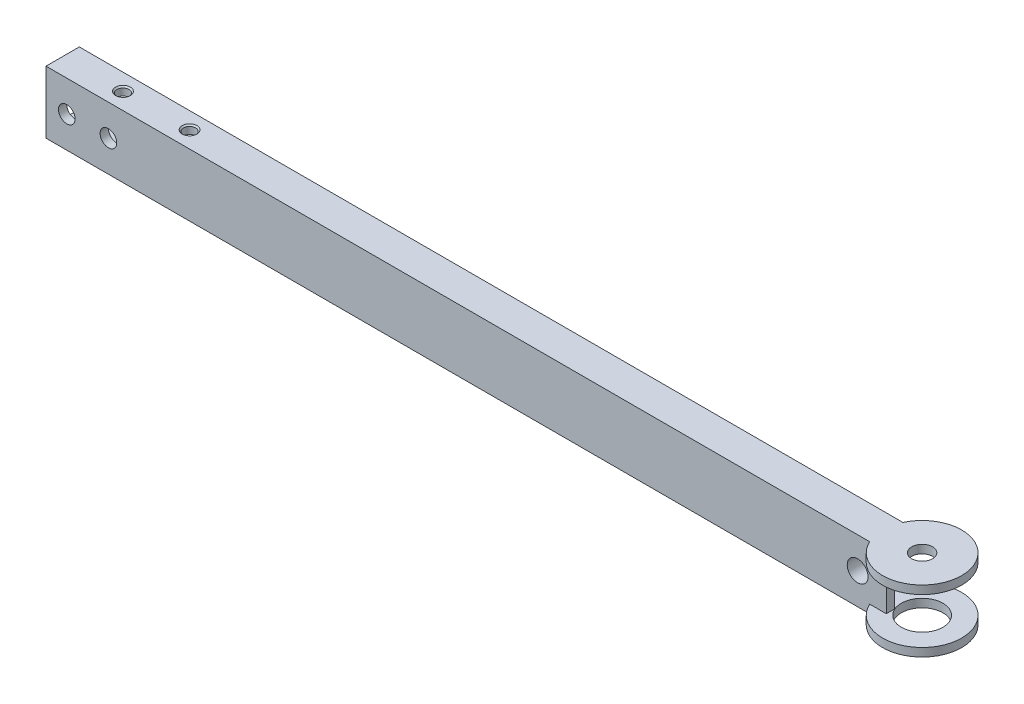
ISO-10303-21;
HEADER;
FILE_DESCRIPTION(('STEP AP214'),'2;1');
FILE_NAME('part.step','',(''),(''),'','','');
FILE_SCHEMA(('AUTOMOTIVE_DESIGN { 1 0 10303 214 1 1 1 1 }'));
ENDSEC;
DATA;
#1=APPLICATION_CONTEXT('core data for automotive mechanical design processes');
#2=APPLICATION_PROTOCOL_DEFINITION('international standard','automotive_design',2000,#1);
#3=PRODUCT_CONTEXT('',#1,'mechanical');
#4=PRODUCT('Part','Part','',(#3));
#5=PRODUCT_RELATED_PRODUCT_CATEGORY('part','',(#4));
#6=PRODUCT_DEFINITION_FORMATION('','',#4);
#7=PRODUCT_DEFINITION_CONTEXT('part definition',#1,'design');
#8=PRODUCT_DEFINITION('design','',#6,#7);
#9=PRODUCT_DEFINITION_SHAPE('','',#8);
#10=(LENGTH_UNIT() NAMED_UNIT(*) SI_UNIT(.MILLI.,.METRE.));
#11=(NAMED_UNIT(*) PLANE_ANGLE_UNIT() SI_UNIT($,.RADIAN.));
#12=(NAMED_UNIT(*) SI_UNIT($,.STERADIAN.) SOLID_ANGLE_UNIT());
#13=UNCERTAINTY_MEASURE_WITH_UNIT(LENGTH_MEASURE(1.E-05),#10,'distance_accuracy_value','');
#14=(GEOMETRIC_REPRESENTATION_CONTEXT(3) GLOBAL_UNCERTAINTY_ASSIGNED_CONTEXT((#13)) GLOBAL_UNIT_ASSIGNED_CONTEXT((#10,
#11,#12)) REPRESENTATION_CONTEXT('',''));
#15=CARTESIAN_POINT('',(0.,0.,0.));
#16=DIRECTION('',(0.,0.,1.));
#17=DIRECTION('',(1.,0.,0.));
#18=AXIS2_PLACEMENT_3D('',#15,#16,#17);
#19=CARTESIAN_POINT('',(0.,15.,0.));
#20=DIRECTION('',(0.,-1.,0.));
#21=DIRECTION('',(0.,0.,-1.));
#22=AXIS2_PLACEMENT_3D('',#19,#20,#21);
#23=PLANE('',#22);
#24=CARTESIAN_POINT('',(-192.,15.,0.));
#25=DIRECTION('',(0.,1.,0.));
#26=DIRECTION('',(0.,0.,1.));
#27=AXIS2_PLACEMENT_3D('',#24,#25,#26);
#28=CIRCLE('',#27,1.775);
#29=CARTESIAN_POINT('',(-192.,15.,1.775));
#30=VERTEX_POINT('',#29);
#31=EDGE_CURVE('E369',#30,#30,#28,.T.);
#32=ORIENTED_EDGE('',*,*,#31,.F.);
#33=EDGE_LOOP('',(#32));
#34=FACE_BOUND('',#33,.T.);
#35=DIRECTION('',(0.,0.,1.));
#36=VECTOR('',#35,1.);
#37=CARTESIAN_POINT('',(-206.5,15.,-4.));
#38=LINE('',#37,#36);
#39=CARTESIAN_POINT('',(-206.5,15.,-4.));
#40=VERTEX_POINT('',#39);
#41=CARTESIAN_POINT('',(-206.5,15.,4.));
#42=VERTEX_POINT('',#41);
#43=EDGE_CURVE('E174',#40,#42,#38,.T.);
#44=ORIENTED_EDGE('',*,*,#43,.T.);
#45=DIRECTION('',(1.,0.,0.));
#46=VECTOR('',#45,1.);
#47=CARTESIAN_POINT('',(-206.5,15.,4.));
#48=LINE('',#47,#46);
#49=CARTESIAN_POINT('',(-8.61684396980705,15.,4.));
#50=VERTEX_POINT('',#49);
#51=EDGE_CURVE('E178',#42,#50,#48,.T.);
#52=ORIENTED_EDGE('',*,*,#51,.T.);
#53=CARTESIAN_POINT('',(0.,15.,0.));
#54=DIRECTION('',(0.,1.,0.));
#55=DIRECTION('',(0.,0.,-1.));
#56=AXIS2_PLACEMENT_3D('',#53,#54,#55);
#57=CIRCLE('',#56,9.50000000000001);
#58=CARTESIAN_POINT('',(-8.61684396980705,15.,-4.));
#59=VERTEX_POINT('',#58);
#60=EDGE_CURVE('E182',#50,#59,#57,.T.);
#61=ORIENTED_EDGE('',*,*,#60,.T.);
#62=DIRECTION('',(-1.,0.,0.));
#63=VECTOR('',#62,1.);
#64=CARTESIAN_POINT('',(-206.5,15.,-4.));
#65=LINE('',#64,#63);
#66=EDGE_CURVE('E185',#59,#40,#65,.T.);
#67=ORIENTED_EDGE('',*,*,#66,.T.);
#68=EDGE_LOOP('',(#44,#52,#61,#67));
#69=FACE_BOUND('',#68,.T.);
#70=CARTESIAN_POINT('',(0.,15.,0.));
#71=DIRECTION('',(0.,1.,0.));
#72=DIRECTION('',(0.,0.,1.));
#73=AXIS2_PLACEMENT_3D('',#70,#71,#72);
#74=CIRCLE('',#73,2.5);
#75=CARTESIAN_POINT('',(0.,15.,2.5));
#76=VERTEX_POINT('',#75);
#77=EDGE_CURVE('E166',#76,#76,#74,.T.);
#78=ORIENTED_EDGE('',*,*,#77,.F.);
#79=EDGE_LOOP('',(#78));
#80=FACE_BOUND('',#79,.T.);
#81=CARTESIAN_POINT('',(-176.,15.,0.));
#82=DIRECTION('',(0.,1.,0.));
#83=DIRECTION('',(0.,0.,1.));
#84=AXIS2_PLACEMENT_3D('',#81,#82,#83);
#85=CIRCLE('',#84,1.775);
#86=CARTESIAN_POINT('',(-176.,15.,1.775));
#87=VERTEX_POINT('',#86);
#88=EDGE_CURVE('E356',#87,#87,#85,.T.);
#89=ORIENTED_EDGE('',*,*,#88,.F.);
#90=EDGE_LOOP('',(#89));
#91=FACE_BOUND('',#90,.T.);
#92=ADVANCED_FACE('F47',(#34,#69,#80,#91),#23,.F.);
#93=CARTESIAN_POINT('',(0.,2.,0.));
#94=DIRECTION('',(0.,1.,0.));
#95=DIRECTION('',(0.,0.,1.));
#96=AXIS2_PLACEMENT_3D('',#93,#94,#95);
#97=PLANE('',#96);
#98=CARTESIAN_POINT('',(0.,2.,0.));
#99=DIRECTION('',(0.,1.,0.));
#100=DIRECTION('',(0.,0.,1.));
#101=AXIS2_PLACEMENT_3D('',#98,#99,#100);
#102=CIRCLE('',#101,5.);
#103=CARTESIAN_POINT('',(0.,2.,5.));
#104=VERTEX_POINT('',#103);
#105=EDGE_CURVE('E216',#104,#104,#102,.T.);
#106=ORIENTED_EDGE('',*,*,#105,.F.);
#107=EDGE_LOOP('',(#106));
#108=FACE_BOUND('',#107,.T.);
#109=DIRECTION('',(0.,0.,-1.));
#110=VECTOR('',#109,1.);
#111=CARTESIAN_POINT('',(-4.61684396980705,2.,4.));
#112=LINE('',#111,#110);
#113=CARTESIAN_POINT('',(-4.61684396980705,2.,4.));
#114=VERTEX_POINT('',#113);
#115=CARTESIAN_POINT('',(-4.61684396980705,2.,2.));
#116=VERTEX_POINT('',#115);
#117=EDGE_CURVE('E67',#114,#116,#112,.T.);
#118=ORIENTED_EDGE('',*,*,#117,.F.);
#119=DIRECTION('',(-1.,0.,0.));
#120=VECTOR('',#119,1.);
#121=CARTESIAN_POINT('',(-4.61684396980705,2.,4.));
#122=LINE('',#121,#120);
#123=CARTESIAN_POINT('',(-8.61684396980705,2.,4.));
#124=VERTEX_POINT('',#123);
#125=EDGE_CURVE('E137',#114,#124,#122,.T.);
#126=ORIENTED_EDGE('',*,*,#125,.T.);
#127=CARTESIAN_POINT('',(0.,2.,0.));
#128=DIRECTION('',(0.,1.,0.));
#129=DIRECTION('',(0.,0.,1.));
#130=AXIS2_PLACEMENT_3D('',#127,#128,#129);
#131=CIRCLE('',#130,9.5);
#132=CARTESIAN_POINT('',(-8.61684396980705,2.,-4.));
#133=VERTEX_POINT('',#132);
#134=EDGE_CURVE('E227',#124,#133,#131,.T.);
#135=ORIENTED_EDGE('',*,*,#134,.T.);
#136=DIRECTION('',(-1.,0.,0.));
#137=VECTOR('',#136,1.);
#138=CARTESIAN_POINT('',(-206.5,2.,-4.));
#139=LINE('',#138,#137);
#140=CARTESIAN_POINT('',(-206.5,2.,-4.));
#141=VERTEX_POINT('',#140);
#142=EDGE_CURVE('E231',#133,#141,#139,.T.);
#143=ORIENTED_EDGE('',*,*,#142,.T.);
#144=DIRECTION('',(0.,0.,1.));
#145=VECTOR('',#144,1.);
#146=CARTESIAN_POINT('',(-206.5,2.,-4.));
#147=LINE('',#146,#145);
#148=CARTESIAN_POINT('',(-206.5,2.,2.));
#149=VERTEX_POINT('',#148);
#150=EDGE_CURVE('E224',#141,#149,#147,.T.);
#151=ORIENTED_EDGE('',*,*,#150,.T.);
#152=DIRECTION('',(-1.,0.,0.));
#153=VECTOR('',#152,1.);
#154=CARTESIAN_POINT('',(-8.61684396980705,2.,2.));
#155=LINE('',#154,#153);
#156=EDGE_CURVE('E63',#116,#149,#155,.T.);
#157=ORIENTED_EDGE('',*,*,#156,.F.);
#158=EDGE_LOOP('',(#118,#126,#135,#143,#151,#157));
#159=FACE_BOUND('',#158,.T.);
#160=ADVANCED_FACE('F282',(#108,#159),#97,.T.);
#161=CARTESIAN_POINT('',(0.,13.,0.));
#162=DIRECTION('',(0.,-1.,0.));
#163=DIRECTION('',(0.,0.,-1.));
#164=AXIS2_PLACEMENT_3D('',#161,#162,#163);
#165=PLANE('',#164);
#166=CARTESIAN_POINT('',(-176.,13.,0.));
#167=DIRECTION('',(0.,-1.,0.));
#168=DIRECTION('',(0.,0.,-1.));
#169=AXIS2_PLACEMENT_3D('',#166,#167,#168);
#170=CIRCLE('',#169,1.45000000000001);
#171=CARTESIAN_POINT('',(-176.,13.,-1.45000000000001));
#172=VERTEX_POINT('',#171);
#173=EDGE_CURVE('E363',#172,#172,#170,.T.);
#174=ORIENTED_EDGE('',*,*,#173,.F.);
#175=EDGE_LOOP('',(#174));
#176=FACE_BOUND('',#175,.T.);
#177=CARTESIAN_POINT('',(-192.,13.,0.));
#178=DIRECTION('',(0.,-1.,0.));
#179=DIRECTION('',(0.,0.,-1.));
#180=AXIS2_PLACEMENT_3D('',#177,#178,#179);
#181=CIRCLE('',#180,1.45000000000001);
#182=CARTESIAN_POINT('',(-192.,13.,-1.45000000000001));
#183=VERTEX_POINT('',#182);
#184=EDGE_CURVE('E377',#183,#183,#181,.T.);
#185=ORIENTED_EDGE('',*,*,#184,.F.);
#186=EDGE_LOOP('',(#185));
#187=FACE_BOUND('',#186,.T.);
#188=CARTESIAN_POINT('',(0.,13.,0.));
#189=DIRECTION('',(0.,1.,0.));
#190=DIRECTION('',(0.,0.,1.));
#191=AXIS2_PLACEMENT_3D('',#188,#189,#190);
#192=CIRCLE('',#191,2.5);
#193=CARTESIAN_POINT('',(0.,13.,2.5));
#194=VERTEX_POINT('',#193);
#195=EDGE_CURVE('E136',#194,#194,#192,.T.);
#196=ORIENTED_EDGE('',*,*,#195,.T.);
#197=EDGE_LOOP('',(#196));
#198=FACE_BOUND('',#197,.T.);
#199=CARTESIAN_POINT('',(0.,13.,0.));
#200=DIRECTION('',(0.,1.,0.));
#201=DIRECTION('',(0.,0.,-1.));
#202=AXIS2_PLACEMENT_3D('',#199,#200,#201);
#203=CIRCLE('',#202,9.50000000000001);
#204=CARTESIAN_POINT('',(-8.61684396980705,13.,4.));
#205=VERTEX_POINT('',#204);
#206=CARTESIAN_POINT('',(-8.61684396980705,13.,-4.));
#207=VERTEX_POINT('',#206);
#208=EDGE_CURVE('E132',#205,#207,#203,.T.);
#209=ORIENTED_EDGE('',*,*,#208,.F.);
#210=DIRECTION('',(-1.,0.,0.));
#211=VECTOR('',#210,1.);
#212=CARTESIAN_POINT('',(-4.61684396980705,13.,4.));
#213=LINE('',#212,#211);
#214=CARTESIAN_POINT('',(-4.61684396980705,13.,4.));
#215=VERTEX_POINT('',#214);
#216=EDGE_CURVE('E124',#215,#205,#213,.T.);
#217=ORIENTED_EDGE('',*,*,#216,.F.);
#218=DIRECTION('',(0.,0.,1.));
#219=VECTOR('',#218,1.);
#220=CARTESIAN_POINT('',(-4.61684396980705,13.,2.));
#221=LINE('',#220,#219);
#222=CARTESIAN_POINT('',(-4.61684396980705,13.,2.));
#223=VERTEX_POINT('',#222);
#224=EDGE_CURVE('E129',#223,#215,#221,.T.);
#225=ORIENTED_EDGE('',*,*,#224,.F.);
#226=DIRECTION('',(-1.,0.,0.));
#227=VECTOR('',#226,1.);
#228=CARTESIAN_POINT('',(-8.61684396980705,13.,2.));
#229=LINE('',#228,#227);
#230=CARTESIAN_POINT('',(-206.5,13.,2.));
#231=VERTEX_POINT('',#230);
#232=EDGE_CURVE('E210',#223,#231,#229,.T.);
#233=ORIENTED_EDGE('',*,*,#232,.T.);
#234=DIRECTION('',(0.,0.,1.));
#235=VECTOR('',#234,1.);
#236=CARTESIAN_POINT('',(-206.5,13.,-4.));
#237=LINE('',#236,#235);
#238=CARTESIAN_POINT('',(-206.5,13.,-4.));
#239=VERTEX_POINT('',#238);
#240=EDGE_CURVE('E170',#239,#231,#237,.T.);
#241=ORIENTED_EDGE('',*,*,#240,.F.);
#242=DIRECTION('',(-1.,0.,0.));
#243=VECTOR('',#242,1.);
#244=CARTESIAN_POINT('',(-206.5,13.,-4.));
#245=LINE('',#244,#243);
#246=EDGE_CURVE('E179',#207,#239,#245,.T.);
#247=ORIENTED_EDGE('',*,*,#246,.F.);
#248=EDGE_LOOP('',(#209,#217,#225,#233,#241,#247));
#249=FACE_BOUND('',#248,.T.);
#250=ADVANCED_FACE('F126',(#176,#187,#198,#249),#165,.T.);
#251=CARTESIAN_POINT('',(0.,0.,0.));
#252=DIRECTION('',(0.,1.,0.));
#253=DIRECTION('',(0.,0.,1.));
#254=AXIS2_PLACEMENT_3D('',#251,#252,#253);
#255=PLANE('',#254);
#256=DIRECTION('',(0.,0.,1.));
#257=VECTOR('',#256,1.);
#258=CARTESIAN_POINT('',(-206.5,0.,-4.));
#259=LINE('',#258,#257);
#260=CARTESIAN_POINT('',(-206.5,0.,-4.));
#261=VERTEX_POINT('',#260);
#262=CARTESIAN_POINT('',(-206.5,0.,4.));
#263=VERTEX_POINT('',#262);
#264=EDGE_CURVE('E220',#261,#263,#259,.T.);
#265=ORIENTED_EDGE('',*,*,#264,.F.);
#266=DIRECTION('',(-1.,0.,0.));
#267=VECTOR('',#266,1.);
#268=CARTESIAN_POINT('',(-206.5,0.,-4.));
#269=LINE('',#268,#267);
#270=CARTESIAN_POINT('',(-8.61684396980705,0.,-4.));
#271=VERTEX_POINT('',#270);
#272=EDGE_CURVE('E228',#271,#261,#269,.T.);
#273=ORIENTED_EDGE('',*,*,#272,.F.);
#274=CARTESIAN_POINT('',(0.,0.,0.));
#275=DIRECTION('',(0.,1.,0.));
#276=DIRECTION('',(0.,0.,1.));
#277=AXIS2_PLACEMENT_3D('',#274,#275,#276);
#278=CIRCLE('',#277,9.5);
#279=CARTESIAN_POINT('',(-8.61684396980705,0.,4.));
#280=VERTEX_POINT('',#279);
#281=EDGE_CURVE('E241',#280,#271,#278,.T.);
#282=ORIENTED_EDGE('',*,*,#281,.F.);
#283=DIRECTION('',(1.,0.,0.));
#284=VECTOR('',#283,1.);
#285=CARTESIAN_POINT('',(-8.61684396980705,0.,4.));
#286=LINE('',#285,#284);
#287=EDGE_CURVE('E238',#263,#280,#286,.T.);
#288=ORIENTED_EDGE('',*,*,#287,.F.);
#289=EDGE_LOOP('',(#265,#273,#282,#288));
#290=FACE_BOUND('',#289,.T.);
#291=CARTESIAN_POINT('',(0.,0.,0.));
#292=DIRECTION('',(0.,1.,0.));
#293=DIRECTION('',(0.,0.,1.));
#294=AXIS2_PLACEMENT_3D('',#291,#292,#293);
#295=CIRCLE('',#294,5.);
#296=CARTESIAN_POINT('',(0.,0.,5.));
#297=VERTEX_POINT('',#296);
#298=EDGE_CURVE('E213',#297,#297,#295,.T.);
#299=ORIENTED_EDGE('',*,*,#298,.T.);
#300=EDGE_LOOP('',(#299));
#301=FACE_BOUND('',#300,.T.);
#302=ADVANCED_FACE('F298',(#290,#301),#255,.F.);
#303=CARTESIAN_POINT('',(-206.5,2.,-4.));
#304=DIRECTION('',(1.,0.,0.));
#305=DIRECTION('',(0.,0.,-1.));
#306=AXIS2_PLACEMENT_3D('',#303,#304,#305);
#307=PLANE('',#306);
#308=ORIENTED_EDGE('',*,*,#264,.T.);
#309=DIRECTION('',(0.,-1.,0.));
#310=VECTOR('',#309,1.);
#311=CARTESIAN_POINT('',(-206.5,2.,4.));
#312=LINE('',#311,#310);
#313=EDGE_CURVE('E257',#42,#263,#312,.T.);
#314=ORIENTED_EDGE('',*,*,#313,.F.);
#315=ORIENTED_EDGE('',*,*,#43,.F.);
#316=DIRECTION('',(0.,-1.,0.));
#317=VECTOR('',#316,1.);
#318=CARTESIAN_POINT('',(-206.5,15.,-4.));
#319=LINE('',#318,#317);
#320=EDGE_CURVE('E188',#40,#239,#319,.T.);
#321=ORIENTED_EDGE('',*,*,#320,.T.);
#322=ORIENTED_EDGE('',*,*,#240,.T.);
#323=DIRECTION('',(0.,-1.,0.));
#324=VECTOR('',#323,1.);
#325=CARTESIAN_POINT('',(-206.5,2.,2.));
#326=LINE('',#325,#324);
#327=EDGE_CURVE('E206',#231,#149,#326,.T.);
#328=ORIENTED_EDGE('',*,*,#327,.T.);
#329=ORIENTED_EDGE('',*,*,#150,.F.);
#330=DIRECTION('',(0.,-1.,0.));
#331=VECTOR('',#330,1.);
#332=CARTESIAN_POINT('',(-206.5,2.,-4.));
#333=LINE('',#332,#331);
#334=EDGE_CURVE('E234',#141,#261,#333,.T.);
#335=ORIENTED_EDGE('',*,*,#334,.T.);
#336=EDGE_LOOP('',(#308,#314,#315,#321,#322,#328,#329,#335));
#337=FACE_BOUND('',#336,.T.);
#338=ADVANCED_FACE('F319',(#337),#307,.F.);
#339=CARTESIAN_POINT('',(-8.61684396980705,2.,4.));
#340=DIRECTION('',(0.,0.,-1.));
#341=DIRECTION('',(-1.,0.,0.));
#342=AXIS2_PLACEMENT_3D('',#339,#340,#341);
#343=PLANE('',#342);
#344=CARTESIAN_POINT('',(-11.5,7.5,4.));
#345=DIRECTION('',(0.,0.,-1.));
#346=DIRECTION('',(-1.,0.,0.));
#347=AXIS2_PLACEMENT_3D('',#344,#345,#346);
#348=CIRCLE('',#347,2.5);
#349=CARTESIAN_POINT('',(-14.,7.5,4.));
#350=VERTEX_POINT('',#349);
#351=EDGE_CURVE('E381',#350,#350,#348,.F.);
#352=ORIENTED_EDGE('',*,*,#351,.F.);
#353=EDGE_LOOP('',(#352));
#354=FACE_BOUND('',#353,.T.);
#355=CARTESIAN_POINT('',(-201.5,7.5,4.));
#356=DIRECTION('',(0.,0.,-1.));
#357=DIRECTION('',(-1.,0.,0.));
#358=AXIS2_PLACEMENT_3D('',#355,#356,#357);
#359=CIRCLE('',#358,2.);
#360=CARTESIAN_POINT('',(-203.5,7.5,4.));
#361=VERTEX_POINT('',#360);
#362=EDGE_CURVE('E150',#361,#361,#359,.F.);
#363=ORIENTED_EDGE('',*,*,#362,.F.);
#364=EDGE_LOOP('',(#363));
#365=FACE_BOUND('',#364,.T.);
#366=CARTESIAN_POINT('',(-191.5,7.5,4.));
#367=DIRECTION('',(0.,0.,-1.));
#368=DIRECTION('',(-1.,0.,0.));
#369=AXIS2_PLACEMENT_3D('',#366,#367,#368);
#370=CIRCLE('',#369,2.);
#371=CARTESIAN_POINT('',(-193.5,7.5,4.));
#372=VERTEX_POINT('',#371);
#373=EDGE_CURVE('E393',#372,#372,#370,.F.);
#374=ORIENTED_EDGE('',*,*,#373,.F.);
#375=EDGE_LOOP('',(#374));
#376=FACE_BOUND('',#375,.T.);
#377=ORIENTED_EDGE('',*,*,#287,.T.);
#378=DIRECTION('',(0.,-1.,0.));
#379=VECTOR('',#378,1.);
#380=CARTESIAN_POINT('',(-8.61684396980705,2.,4.));
#381=LINE('',#380,#379);
#382=EDGE_CURVE('E253',#124,#280,#381,.T.);
#383=ORIENTED_EDGE('',*,*,#382,.F.);
#384=ORIENTED_EDGE('',*,*,#125,.F.);
#385=DIRECTION('',(0.,-1.,0.));
#386=VECTOR('',#385,1.);
#387=CARTESIAN_POINT('',(-4.61684396980705,13.,4.));
#388=LINE('',#387,#386);
#389=EDGE_CURVE('E140',#215,#114,#388,.T.);
#390=ORIENTED_EDGE('',*,*,#389,.F.);
#391=ORIENTED_EDGE('',*,*,#216,.T.);
#392=DIRECTION('',(0.,-1.,0.));
#393=VECTOR('',#392,1.);
#394=CARTESIAN_POINT('',(-8.61684396980705,15.,4.));
#395=LINE('',#394,#393);
#396=EDGE_CURVE('E203',#50,#205,#395,.T.);
#397=ORIENTED_EDGE('',*,*,#396,.F.);
#398=ORIENTED_EDGE('',*,*,#51,.F.);
#399=ORIENTED_EDGE('',*,*,#313,.T.);
#400=EDGE_LOOP('',(#377,#383,#384,#390,#391,#397,#398,#399));
#401=FACE_BOUND('',#400,.T.);
#402=ADVANCED_FACE('F141',(#354,#365,#376,#401),#343,.F.);
#403=CARTESIAN_POINT('',(0.,2.,0.));
#404=DIRECTION('',(0.,-1.,0.));
#405=DIRECTION('',(0.,0.,-1.));
#406=AXIS2_PLACEMENT_3D('',#403,#404,#405);
#407=CYLINDRICAL_SURFACE('',#406,9.5);
#408=ORIENTED_EDGE('',*,*,#281,.T.);
#409=DIRECTION('',(0.,-1.,0.));
#410=VECTOR('',#409,1.);
#411=CARTESIAN_POINT('',(-8.61684396980705,2.,-4.));
#412=LINE('',#411,#410);
#413=EDGE_CURVE('E249',#133,#271,#412,.T.);
#414=ORIENTED_EDGE('',*,*,#413,.F.);
#415=ORIENTED_EDGE('',*,*,#134,.F.);
#416=ORIENTED_EDGE('',*,*,#382,.T.);
#417=EDGE_LOOP('',(#408,#414,#415,#416));
#418=FACE_BOUND('',#417,.T.);
#419=ADVANCED_FACE('F323',(#418),#407,.T.);
#420=CARTESIAN_POINT('',(-206.5,2.,-4.));
#421=DIRECTION('',(0.,0.,1.));
#422=DIRECTION('',(1.,0.,0.));
#423=AXIS2_PLACEMENT_3D('',#420,#421,#422);
#424=PLANE('',#423);
#425=ORIENTED_EDGE('',*,*,#272,.T.);
#426=ORIENTED_EDGE('',*,*,#334,.F.);
#427=ORIENTED_EDGE('',*,*,#142,.F.);
#428=ORIENTED_EDGE('',*,*,#413,.T.);
#429=EDGE_LOOP('',(#425,#426,#427,#428));
#430=FACE_BOUND('',#429,.T.);
#431=ADVANCED_FACE('F314',(#430),#424,.F.);
#432=CARTESIAN_POINT('',(0.,2.,0.));
#433=DIRECTION('',(0.,-1.,0.));
#434=DIRECTION('',(0.,0.,-1.));
#435=AXIS2_PLACEMENT_3D('',#432,#433,#434);
#436=CYLINDRICAL_SURFACE('',#435,5.);
#437=ORIENTED_EDGE('',*,*,#105,.T.);
#438=EDGE_LOOP('',(#437));
#439=FACE_BOUND('',#438,.T.);
#440=ORIENTED_EDGE('',*,*,#298,.F.);
#441=EDGE_LOOP('',(#440));
#442=FACE_BOUND('',#441,.T.);
#443=ADVANCED_FACE('F311',(#439,#442),#436,.F.);
#444=CARTESIAN_POINT('',(-8.61684396980705,2.,2.));
#445=DIRECTION('',(0.,0.,-1.));
#446=DIRECTION('',(-1.,0.,0.));
#447=AXIS2_PLACEMENT_3D('',#444,#445,#446);
#448=PLANE('',#447);
#449=CARTESIAN_POINT('',(-11.5,7.5,2.));
#450=DIRECTION('',(0.,0.,-1.));
#451=DIRECTION('',(-1.,0.,0.));
#452=AXIS2_PLACEMENT_3D('',#449,#450,#451);
#453=CIRCLE('',#452,5.);
#454=CARTESIAN_POINT('',(-16.5,7.5,2.));
#455=VERTEX_POINT('',#454);
#456=EDGE_CURVE('E11',#455,#455,#453,.F.);
#457=ORIENTED_EDGE('',*,*,#456,.T.);
#458=EDGE_LOOP('',(#457));
#459=FACE_BOUND('',#458,.T.);
#460=CARTESIAN_POINT('',(-201.5,7.5,2.));
#461=DIRECTION('',(0.,0.,-1.));
#462=DIRECTION('',(-1.,0.,0.));
#463=AXIS2_PLACEMENT_3D('',#460,#461,#462);
#464=CIRCLE('',#463,2.);
#465=CARTESIAN_POINT('',(-203.5,7.5,2.));
#466=VERTEX_POINT('',#465);
#467=EDGE_CURVE('E154',#466,#466,#464,.T.);
#468=ORIENTED_EDGE('',*,*,#467,.F.);
#469=EDGE_LOOP('',(#468));
#470=FACE_BOUND('',#469,.T.);
#471=CARTESIAN_POINT('',(-191.5,7.5,2.));
#472=DIRECTION('',(0.,0.,-1.));
#473=DIRECTION('',(-1.,0.,0.));
#474=AXIS2_PLACEMENT_3D('',#471,#472,#473);
#475=CIRCLE('',#474,2.);
#476=CARTESIAN_POINT('',(-193.5,7.5,2.));
#477=VERTEX_POINT('',#476);
#478=EDGE_CURVE('E157',#477,#477,#475,.T.);
#479=ORIENTED_EDGE('',*,*,#478,.F.);
#480=EDGE_LOOP('',(#479));
#481=FACE_BOUND('',#480,.T.);
#482=ORIENTED_EDGE('',*,*,#327,.F.);
#483=ORIENTED_EDGE('',*,*,#232,.F.);
#484=DIRECTION('',(0.,1.,0.));
#485=VECTOR('',#484,1.);
#486=CARTESIAN_POINT('',(-4.61684396980705,2.,2.));
#487=LINE('',#486,#485);
#488=EDGE_CURVE('E148',#116,#223,#487,.T.);
#489=ORIENTED_EDGE('',*,*,#488,.F.);
#490=ORIENTED_EDGE('',*,*,#156,.T.);
#491=EDGE_LOOP('',(#482,#483,#489,#490));
#492=FACE_BOUND('',#491,.T.);
#493=ADVANCED_FACE('F307',(#459,#470,#481,#492),#448,.T.);
#494=CARTESIAN_POINT('',(0.,15.,0.));
#495=DIRECTION('',(0.,-1.,0.));
#496=DIRECTION('',(0.,0.,-1.));
#497=AXIS2_PLACEMENT_3D('',#494,#495,#496);
#498=CYLINDRICAL_SURFACE('',#497,9.50000000000001);
#499=ORIENTED_EDGE('',*,*,#208,.T.);
#500=DIRECTION('',(0.,-1.,0.));
#501=VECTOR('',#500,1.);
#502=CARTESIAN_POINT('',(-8.61684396980705,15.,-4.));
#503=LINE('',#502,#501);
#504=EDGE_CURVE('E199',#59,#207,#503,.T.);
#505=ORIENTED_EDGE('',*,*,#504,.F.);
#506=ORIENTED_EDGE('',*,*,#60,.F.);
#507=ORIENTED_EDGE('',*,*,#396,.T.);
#508=EDGE_LOOP('',(#499,#505,#506,#507));
#509=FACE_BOUND('',#508,.T.);
#510=ADVANCED_FACE('F303',(#509),#498,.T.);
#511=CARTESIAN_POINT('',(-206.5,15.,-4.));
#512=DIRECTION('',(0.,0.,1.));
#513=DIRECTION('',(1.,0.,0.));
#514=AXIS2_PLACEMENT_3D('',#511,#512,#513);
#515=PLANE('',#514);
#516=ORIENTED_EDGE('',*,*,#246,.T.);
#517=ORIENTED_EDGE('',*,*,#320,.F.);
#518=ORIENTED_EDGE('',*,*,#66,.F.);
#519=ORIENTED_EDGE('',*,*,#504,.T.);
#520=EDGE_LOOP('',(#516,#517,#518,#519));
#521=FACE_BOUND('',#520,.T.);
#522=ADVANCED_FACE('F300',(#521),#515,.F.);
#523=CARTESIAN_POINT('',(0.,15.,0.));
#524=DIRECTION('',(0.,-1.,0.));
#525=DIRECTION('',(0.,0.,-1.));
#526=AXIS2_PLACEMENT_3D('',#523,#524,#525);
#527=CYLINDRICAL_SURFACE('',#526,2.5);
#528=ORIENTED_EDGE('',*,*,#77,.T.);
#529=EDGE_LOOP('',(#528));
#530=FACE_BOUND('',#529,.T.);
#531=ORIENTED_EDGE('',*,*,#195,.F.);
#532=EDGE_LOOP('',(#531));
#533=FACE_BOUND('',#532,.T.);
#534=ADVANCED_FACE('F294',(#530,#533),#527,.F.);
#535=CARTESIAN_POINT('',(-4.61684396980705,0.,0.));
#536=DIRECTION('',(1.,0.,0.));
#537=DIRECTION('',(0.,0.,-1.));
#538=AXIS2_PLACEMENT_3D('',#535,#536,#537);
#539=PLANE('',#538);
#540=ORIENTED_EDGE('',*,*,#224,.T.);
#541=ORIENTED_EDGE('',*,*,#389,.T.);
#542=ORIENTED_EDGE('',*,*,#117,.T.);
#543=ORIENTED_EDGE('',*,*,#488,.T.);
#544=EDGE_LOOP('',(#540,#541,#542,#543));
#545=FACE_BOUND('',#544,.T.);
#546=ADVANCED_FACE('F146',(#545),#539,.T.);
#547=CARTESIAN_POINT('',(-191.5,7.5,9.501));
#548=DIRECTION('',(0.,0.,-1.));
#549=DIRECTION('',(-1.,0.,0.));
#550=AXIS2_PLACEMENT_3D('',#547,#548,#549);
#551=CYLINDRICAL_SURFACE('',#550,2.);
#552=ORIENTED_EDGE('',*,*,#478,.T.);
#553=EDGE_LOOP('',(#552));
#554=FACE_BOUND('',#553,.T.);
#555=ORIENTED_EDGE('',*,*,#373,.T.);
#556=EDGE_LOOP('',(#555));
#557=FACE_BOUND('',#556,.T.);
#558=ADVANCED_FACE('F404',(#554,#557),#551,.F.);
#559=CARTESIAN_POINT('',(-201.5,7.5,9.501));
#560=DIRECTION('',(0.,0.,-1.));
#561=DIRECTION('',(-1.,0.,0.));
#562=AXIS2_PLACEMENT_3D('',#559,#560,#561);
#563=CYLINDRICAL_SURFACE('',#562,2.);
#564=ORIENTED_EDGE('',*,*,#467,.T.);
#565=EDGE_LOOP('',(#564));
#566=FACE_BOUND('',#565,.T.);
#567=ORIENTED_EDGE('',*,*,#362,.T.);
#568=EDGE_LOOP('',(#567));
#569=FACE_BOUND('',#568,.T.);
#570=ADVANCED_FACE('F407',(#566,#569),#563,.F.);
#571=CARTESIAN_POINT('',(-11.5,7.5,-2.));
#572=DIRECTION('',(0.,0.,-1.));
#573=DIRECTION('',(-1.,0.,0.));
#574=AXIS2_PLACEMENT_3D('',#571,#572,#573);
#575=PLANE('',#574);
#576=CARTESIAN_POINT('',(-11.5,7.5,-2.));
#577=DIRECTION('',(0.,0.,-1.));
#578=DIRECTION('',(-1.,0.,0.));
#579=AXIS2_PLACEMENT_3D('',#576,#577,#578);
#580=CIRCLE('',#579,4.);
#581=CARTESIAN_POINT('',(-15.5,7.5,-2.));
#582=VERTEX_POINT('',#581);
#583=EDGE_CURVE('E389',#582,#582,#580,.T.);
#584=ORIENTED_EDGE('',*,*,#583,.T.);
#585=EDGE_LOOP('',(#584));
#586=FACE_BOUND('',#585,.T.);
#587=CARTESIAN_POINT('',(-11.5,7.5,-2.));
#588=DIRECTION('',(0.,0.,-1.));
#589=DIRECTION('',(-1.,0.,0.));
#590=AXIS2_PLACEMENT_3D('',#587,#588,#589);
#591=CIRCLE('',#590,2.5);
#592=CARTESIAN_POINT('',(-14.,7.5,-2.));
#593=VERTEX_POINT('',#592);
#594=EDGE_CURVE('E385',#593,#593,#591,.T.);
#595=ORIENTED_EDGE('',*,*,#594,.F.);
#596=EDGE_LOOP('',(#595));
#597=FACE_BOUND('',#596,.T.);
#598=ADVANCED_FACE('F413',(#586,#597),#575,.T.);
#599=CARTESIAN_POINT('',(-11.5,7.5,-2.));
#600=DIRECTION('',(0.,0.,1.));
#601=DIRECTION('',(1.,0.,0.));
#602=AXIS2_PLACEMENT_3D('',#599,#600,#601);
#603=CYLINDRICAL_SURFACE('',#602,4.);
#604=CARTESIAN_POINT('',(-11.5,7.5,1.));
#605=DIRECTION('',(0.,0.,-1.));
#606=DIRECTION('',(-1.,0.,0.));
#607=AXIS2_PLACEMENT_3D('',#604,#605,#606);
#608=CIRCLE('',#607,4.);
#609=CARTESIAN_POINT('',(-15.5,7.5,1.));
#610=VERTEX_POINT('',#609);
#611=EDGE_CURVE('E56',#610,#610,#608,.T.);
#612=ORIENTED_EDGE('',*,*,#611,.T.);
#613=EDGE_LOOP('',(#612));
#614=FACE_BOUND('',#613,.T.);
#615=ORIENTED_EDGE('',*,*,#583,.F.);
#616=EDGE_LOOP('',(#615));
#617=FACE_BOUND('',#616,.T.);
#618=ADVANCED_FACE('F264',(#614,#617),#603,.T.);
#619=CARTESIAN_POINT('',(-11.5,7.5,-2.));
#620=DIRECTION('',(0.,0.,1.));
#621=DIRECTION('',(1.,0.,0.));
#622=AXIS2_PLACEMENT_3D('',#619,#620,#621);
#623=CYLINDRICAL_SURFACE('',#622,2.5);
#624=ORIENTED_EDGE('',*,*,#594,.T.);
#625=EDGE_LOOP('',(#624));
#626=FACE_BOUND('',#625,.T.);
#627=ORIENTED_EDGE('',*,*,#351,.T.);
#628=EDGE_LOOP('',(#627));
#629=FACE_BOUND('',#628,.T.);
#630=ADVANCED_FACE('F269',(#626,#629),#623,.F.);
#631=CARTESIAN_POINT('',(-11.5,7.5,1.));
#632=DIRECTION('',(0.,0.,-1.));
#633=DIRECTION('',(-1.,0.,0.));
#634=AXIS2_PLACEMENT_3D('',#631,#632,#633);
#635=TOROIDAL_SURFACE('',#634,5.,1.);
#636=ORIENTED_EDGE('',*,*,#456,.F.);
#637=EDGE_LOOP('',(#636));
#638=FACE_BOUND('',#637,.T.);
#639=ORIENTED_EDGE('',*,*,#611,.F.);
#640=EDGE_LOOP('',(#639));
#641=FACE_BOUND('',#640,.T.);
#642=ADVANCED_FACE('F49',(#638,#641),#635,.F.);
#643=CARTESIAN_POINT('',(-192.,15.,0.));
#644=DIRECTION('',(0.,1.,0.));
#645=DIRECTION('',(0.,0.,1.));
#646=AXIS2_PLACEMENT_3D('',#643,#644,#645);
#647=CYLINDRICAL_SURFACE('',#646,1.45000000000001);
#648=CARTESIAN_POINT('',(-192.,14.675,0.));
#649=DIRECTION('',(0.,1.,0.));
#650=DIRECTION('',(0.,0.,1.));
#651=AXIS2_PLACEMENT_3D('',#648,#649,#650);
#652=CIRCLE('',#651,1.45000000000001);
#653=CARTESIAN_POINT('',(-192.,14.675,1.45000000000001));
#654=VERTEX_POINT('',#653);
#655=EDGE_CURVE('E373',#654,#654,#652,.T.);
#656=ORIENTED_EDGE('',*,*,#655,.T.);
#657=EDGE_LOOP('',(#656));
#658=FACE_BOUND('',#657,.T.);
#659=ORIENTED_EDGE('',*,*,#184,.T.);
#660=EDGE_LOOP('',(#659));
#661=FACE_BOUND('',#660,.T.);
#662=ADVANCED_FACE('F268',(#658,#661),#647,.F.);
#663=CARTESIAN_POINT('',(-192.,15.,0.));
#664=DIRECTION('',(0.,1.,0.));
#665=DIRECTION('',(0.,0.,1.));
#666=AXIS2_PLACEMENT_3D('',#663,#664,#665);
#667=CONICAL_SURFACE('',#666,1.775,0.785398163397435);
#668=ORIENTED_EDGE('',*,*,#655,.F.);
#669=EDGE_LOOP('',(#668));
#670=FACE_BOUND('',#669,.T.);
#671=ORIENTED_EDGE('',*,*,#31,.T.);
#672=EDGE_LOOP('',(#671));
#673=FACE_BOUND('',#672,.T.);
#674=ADVANCED_FACE('F275',(#670,#673),#667,.F.);
#675=CARTESIAN_POINT('',(-176.,15.,0.));
#676=DIRECTION('',(0.,1.,0.));
#677=DIRECTION('',(0.,0.,1.));
#678=AXIS2_PLACEMENT_3D('',#675,#676,#677);
#679=CYLINDRICAL_SURFACE('',#678,1.45000000000001);
#680=CARTESIAN_POINT('',(-176.,14.675,0.));
#681=DIRECTION('',(0.,1.,0.));
#682=DIRECTION('',(0.,0.,1.));
#683=AXIS2_PLACEMENT_3D('',#680,#681,#682);
#684=CIRCLE('',#683,1.45000000000001);
#685=CARTESIAN_POINT('',(-176.,14.675,1.45000000000001));
#686=VERTEX_POINT('',#685);
#687=EDGE_CURVE('E359',#686,#686,#684,.T.);
#688=ORIENTED_EDGE('',*,*,#687,.T.);
#689=EDGE_LOOP('',(#688));
#690=FACE_BOUND('',#689,.T.);
#691=ORIENTED_EDGE('',*,*,#173,.T.);
#692=EDGE_LOOP('',(#691));
#693=FACE_BOUND('',#692,.T.);
#694=ADVANCED_FACE('F424',(#690,#693),#679,.F.);
#695=CARTESIAN_POINT('',(-176.,15.,0.));
#696=DIRECTION('',(0.,1.,0.));
#697=DIRECTION('',(0.,0.,1.));
#698=AXIS2_PLACEMENT_3D('',#695,#696,#697);
#699=CONICAL_SURFACE('',#698,1.775,0.785398163397435);
#700=ORIENTED_EDGE('',*,*,#687,.F.);
#701=EDGE_LOOP('',(#700));
#702=FACE_BOUND('',#701,.T.);
#703=ORIENTED_EDGE('',*,*,#88,.T.);
#704=EDGE_LOOP('',(#703));
#705=FACE_BOUND('',#704,.T.);
#706=ADVANCED_FACE('F428',(#702,#705),#699,.F.);
#707=CLOSED_SHELL('',(#92,#160,#250,#302,#338,#402,#419,#431,#443,#493,#510,#522,#534,#546,#558,
#570,#598,#618,#630,#642,#662,#674,#694,#706));
#708=MANIFOLD_SOLID_BREP('B2',#707);
#709=ADVANCED_BREP_SHAPE_REPRESENTATION('',(#18,#708),#14);
#710=SHAPE_DEFINITION_REPRESENTATION(#9,#709);
ENDSEC;
END-ISO-10303-21;
